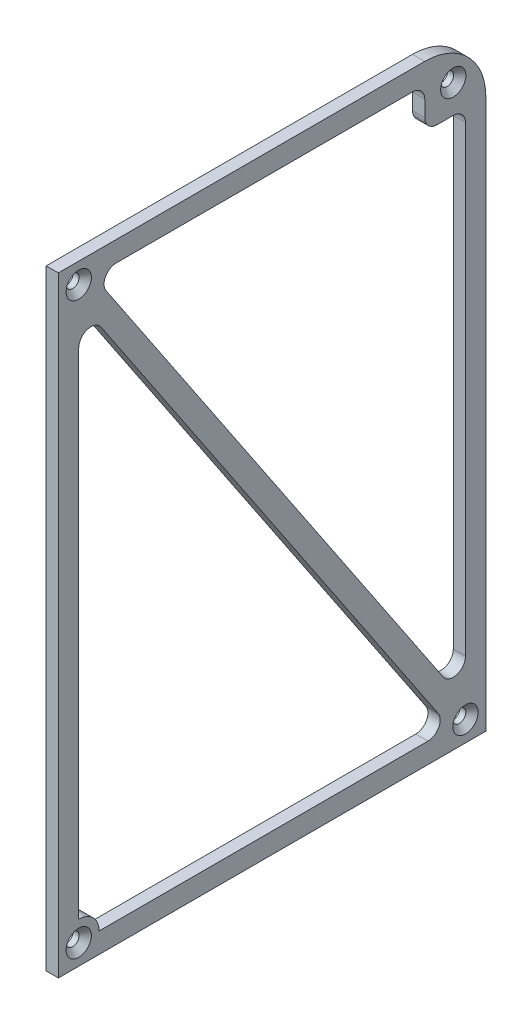
ISO-10303-21;
HEADER;
FILE_DESCRIPTION(('STEP AP214'),'2;1');
FILE_NAME('part.step','',(''),(''),'','','');
FILE_SCHEMA(('AUTOMOTIVE_DESIGN { 1 0 10303 214 1 1 1 1 }'));
ENDSEC;
DATA;
#1=APPLICATION_CONTEXT('core data for automotive mechanical design processes');
#2=APPLICATION_PROTOCOL_DEFINITION('international standard','automotive_design',2000,#1);
#3=PRODUCT_CONTEXT('',#1,'mechanical');
#4=PRODUCT('Part','Part','',(#3));
#5=PRODUCT_RELATED_PRODUCT_CATEGORY('part','',(#4));
#6=PRODUCT_DEFINITION_FORMATION('','',#4);
#7=PRODUCT_DEFINITION_CONTEXT('part definition',#1,'design');
#8=PRODUCT_DEFINITION('design','',#6,#7);
#9=PRODUCT_DEFINITION_SHAPE('','',#8);
#10=(LENGTH_UNIT() NAMED_UNIT(*) SI_UNIT(.MILLI.,.METRE.));
#11=(NAMED_UNIT(*) PLANE_ANGLE_UNIT() SI_UNIT($,.RADIAN.));
#12=(NAMED_UNIT(*) SI_UNIT($,.STERADIAN.) SOLID_ANGLE_UNIT());
#13=UNCERTAINTY_MEASURE_WITH_UNIT(LENGTH_MEASURE(1.E-05),#10,'distance_accuracy_value','');
#14=(GEOMETRIC_REPRESENTATION_CONTEXT(3) GLOBAL_UNCERTAINTY_ASSIGNED_CONTEXT((#13)) GLOBAL_UNIT_ASSIGNED_CONTEXT((#10,
#11,#12)) REPRESENTATION_CONTEXT('',''));
#15=CARTESIAN_POINT('',(0.,0.,0.));
#16=DIRECTION('',(0.,0.,1.));
#17=DIRECTION('',(1.,0.,0.));
#18=AXIS2_PLACEMENT_3D('',#15,#16,#17);
#19=CARTESIAN_POINT('',(3.,5.,0.));
#20=DIRECTION('',(0.,1.,0.));
#21=DIRECTION('',(0.,0.,1.));
#22=AXIS2_PLACEMENT_3D('',#19,#20,#21);
#23=PLANE('',#22);
#24=DIRECTION('',(0.,0.,-1.));
#25=VECTOR('',#24,1.);
#26=CARTESIAN_POINT('',(3.,5.,0.));
#27=LINE('',#26,#25);
#28=CARTESIAN_POINT('',(3.,5.,-10.));
#29=VERTEX_POINT('',#28);
#30=CARTESIAN_POINT('',(3.,5.,-90.7784812930599));
#31=VERTEX_POINT('',#30);
#32=EDGE_CURVE('E228',#29,#31,#27,.T.);
#33=ORIENTED_EDGE('',*,*,#32,.T.);
#34=DIRECTION('',(-1.,0.,0.));
#35=VECTOR('',#34,1.);
#36=CARTESIAN_POINT('',(3.,5.,-90.7784812930599));
#37=LINE('',#36,#35);
#38=CARTESIAN_POINT('',(0.,5.,-90.7784812930599));
#39=VERTEX_POINT('',#38);
#40=EDGE_CURVE('E327',#31,#39,#37,.T.);
#41=ORIENTED_EDGE('',*,*,#40,.T.);
#42=DIRECTION('',(0.,0.,-1.));
#43=VECTOR('',#42,1.);
#44=CARTESIAN_POINT('',(0.,5.,0.));
#45=LINE('',#44,#43);
#46=CARTESIAN_POINT('',(0.,5.,-10.));
#47=VERTEX_POINT('',#46);
#48=EDGE_CURVE('E277',#47,#39,#45,.T.);
#49=ORIENTED_EDGE('',*,*,#48,.F.);
#50=DIRECTION('',(-1.,0.,0.));
#51=VECTOR('',#50,1.);
#52=CARTESIAN_POINT('',(3.,5.,-10.));
#53=LINE('',#52,#51);
#54=EDGE_CURVE('E289',#29,#47,#53,.T.);
#55=ORIENTED_EDGE('',*,*,#54,.F.);
#56=EDGE_LOOP('',(#33,#41,#49,#55));
#57=FACE_BOUND('',#56,.T.);
#58=ADVANCED_FACE('F35',(#57),#23,.T.);
#59=CARTESIAN_POINT('',(3.,5.,-5.));
#60=DIRECTION('',(-1.,0.,0.));
#61=DIRECTION('',(0.,0.,1.));
#62=AXIS2_PLACEMENT_3D('',#59,#60,#61);
#63=CYLINDRICAL_SURFACE('',#62,5.);
#64=CARTESIAN_POINT('',(0.,5.,-5.));
#65=DIRECTION('',(1.,0.,0.));
#66=DIRECTION('',(0.,0.,-1.));
#67=AXIS2_PLACEMENT_3D('',#64,#65,#66);
#68=CIRCLE('',#67,5.);
#69=CARTESIAN_POINT('',(0.,10.,-5.));
#70=VERTEX_POINT('',#69);
#71=EDGE_CURVE('E280',#47,#70,#68,.T.);
#72=ORIENTED_EDGE('',*,*,#71,.T.);
#73=DIRECTION('',(-1.,0.,0.));
#74=VECTOR('',#73,1.);
#75=CARTESIAN_POINT('',(3.,10.,-5.));
#76=LINE('',#75,#74);
#77=CARTESIAN_POINT('',(3.,10.,-5.));
#78=VERTEX_POINT('',#77);
#79=EDGE_CURVE('E190',#78,#70,#76,.T.);
#80=ORIENTED_EDGE('',*,*,#79,.F.);
#81=CARTESIAN_POINT('',(3.,5.,-5.));
#82=DIRECTION('',(1.,0.,0.));
#83=DIRECTION('',(0.,0.,-1.));
#84=AXIS2_PLACEMENT_3D('',#81,#82,#83);
#85=CIRCLE('',#84,5.);
#86=EDGE_CURVE('E231',#29,#78,#85,.T.);
#87=ORIENTED_EDGE('',*,*,#86,.F.);
#88=ORIENTED_EDGE('',*,*,#54,.T.);
#89=EDGE_LOOP('',(#72,#80,#87,#88));
#90=FACE_BOUND('',#89,.T.);
#91=ADVANCED_FACE('F396',(#90),#63,.T.);
#92=CARTESIAN_POINT('',(3.,0.,-5.));
#93=DIRECTION('',(0.,0.,1.));
#94=DIRECTION('',(1.,0.,0.));
#95=AXIS2_PLACEMENT_3D('',#92,#93,#94);
#96=PLANE('',#95);
#97=DIRECTION('',(0.,1.,0.));
#98=VECTOR('',#97,1.);
#99=CARTESIAN_POINT('',(0.,0.,-5.));
#100=LINE('',#99,#98);
#101=CARTESIAN_POINT('',(0.,131.533751076295,-5.));
#102=VERTEX_POINT('',#101);
#103=EDGE_CURVE('E283',#70,#102,#100,.T.);
#104=ORIENTED_EDGE('',*,*,#103,.T.);
#105=DIRECTION('',(-1.,0.,0.));
#106=VECTOR('',#105,1.);
#107=CARTESIAN_POINT('',(3.,131.533751076295,-5.));
#108=LINE('',#107,#106);
#109=CARTESIAN_POINT('',(3.,131.533751076295,-5.));
#110=VERTEX_POINT('',#109);
#111=EDGE_CURVE('E334',#102,#110,#108,.F.);
#112=ORIENTED_EDGE('',*,*,#111,.T.);
#113=DIRECTION('',(0.,1.,0.));
#114=VECTOR('',#113,1.);
#115=CARTESIAN_POINT('',(3.,0.,-5.));
#116=LINE('',#115,#114);
#117=EDGE_CURVE('E234',#78,#110,#116,.T.);
#118=ORIENTED_EDGE('',*,*,#117,.F.);
#119=ORIENTED_EDGE('',*,*,#79,.T.);
#120=EDGE_LOOP('',(#104,#112,#118,#119));
#121=FACE_BOUND('',#120,.T.);
#122=ADVANCED_FACE('F402',(#121),#96,.F.);
#123=CARTESIAN_POINT('',(3.,0.,-90.));
#124=DIRECTION('',(0.,0.,-1.));
#125=DIRECTION('',(-1.,0.,0.));
#126=AXIS2_PLACEMENT_3D('',#123,#124,#125);
#127=PLANE('',#126);
#128=DIRECTION('',(0.,-1.,0.));
#129=VECTOR('',#128,1.);
#130=CARTESIAN_POINT('',(0.,0.,-90.));
#131=LINE('',#130,#129);
#132=CARTESIAN_POINT('',(0.,142.,-90.));
#133=VERTEX_POINT('',#132);
#134=CARTESIAN_POINT('',(0.,138.,-90.));
#135=VERTEX_POINT('',#134);
#136=EDGE_CURVE('E262',#133,#135,#131,.T.);
#137=ORIENTED_EDGE('',*,*,#136,.T.);
#138=DIRECTION('',(-1.,0.,0.));
#139=VECTOR('',#138,1.);
#140=CARTESIAN_POINT('',(3.,138.,-90.));
#141=LINE('',#140,#139);
#142=CARTESIAN_POINT('',(3.,138.,-90.));
#143=VERTEX_POINT('',#142);
#144=EDGE_CURVE('E313',#135,#143,#141,.F.);
#145=ORIENTED_EDGE('',*,*,#144,.T.);
#146=DIRECTION('',(0.,-1.,0.));
#147=VECTOR('',#146,1.);
#148=CARTESIAN_POINT('',(3.,0.,-90.));
#149=LINE('',#148,#147);
#150=CARTESIAN_POINT('',(3.,142.,-90.));
#151=VERTEX_POINT('',#150);
#152=EDGE_CURVE('E213',#151,#143,#149,.T.);
#153=ORIENTED_EDGE('',*,*,#152,.F.);
#154=DIRECTION('',(-1.,0.,0.));
#155=VECTOR('',#154,1.);
#156=CARTESIAN_POINT('',(0.,142.,-90.));
#157=LINE('',#156,#155);
#158=EDGE_CURVE('E310',#151,#133,#157,.T.);
#159=ORIENTED_EDGE('',*,*,#158,.T.);
#160=EDGE_LOOP('',(#137,#145,#153,#159));
#161=FACE_BOUND('',#160,.T.);
#162=ADVANCED_FACE('F424',(#161),#127,.F.);
#163=CARTESIAN_POINT('',(3.,135.,0.));
#164=DIRECTION('',(0.,1.,0.));
#165=DIRECTION('',(0.,0.,1.));
#166=AXIS2_PLACEMENT_3D('',#163,#164,#165);
#167=PLANE('',#166);
#168=DIRECTION('',(0.,0.,-1.));
#169=VECTOR('',#168,1.);
#170=CARTESIAN_POINT('',(0.,135.,0.));
#171=LINE('',#170,#169);
#172=CARTESIAN_POINT('',(0.,135.,-93.));
#173=VERTEX_POINT('',#172);
#174=CARTESIAN_POINT('',(0.,135.,-97.));
#175=VERTEX_POINT('',#174);
#176=EDGE_CURVE('E265',#173,#175,#171,.T.);
#177=ORIENTED_EDGE('',*,*,#176,.T.);
#178=DIRECTION('',(-1.,0.,0.));
#179=VECTOR('',#178,1.);
#180=CARTESIAN_POINT('',(3.,135.,-97.));
#181=LINE('',#180,#179);
#182=CARTESIAN_POINT('',(3.,135.,-97.));
#183=VERTEX_POINT('',#182);
#184=EDGE_CURVE('E306',#175,#183,#181,.F.);
#185=ORIENTED_EDGE('',*,*,#184,.T.);
#186=DIRECTION('',(0.,0.,-1.));
#187=VECTOR('',#186,1.);
#188=CARTESIAN_POINT('',(3.,135.,0.));
#189=LINE('',#188,#187);
#190=CARTESIAN_POINT('',(3.,135.,-93.));
#191=VERTEX_POINT('',#190);
#192=EDGE_CURVE('E216',#191,#183,#189,.T.);
#193=ORIENTED_EDGE('',*,*,#192,.F.);
#194=DIRECTION('',(-1.,0.,0.));
#195=VECTOR('',#194,1.);
#196=CARTESIAN_POINT('',(3.,135.,-93.));
#197=LINE('',#196,#195);
#198=EDGE_CURVE('E303',#191,#173,#197,.T.);
#199=ORIENTED_EDGE('',*,*,#198,.T.);
#200=EDGE_LOOP('',(#177,#185,#193,#199));
#201=FACE_BOUND('',#200,.T.);
#202=ADVANCED_FACE('F420',(#201),#167,.F.);
#203=CARTESIAN_POINT('',(3.,0.,-100.));
#204=DIRECTION('',(0.,0.,1.));
#205=DIRECTION('',(1.,0.,0.));
#206=AXIS2_PLACEMENT_3D('',#203,#204,#205);
#207=PLANE('',#206);
#208=DIRECTION('',(0.,1.,0.));
#209=VECTOR('',#208,1.);
#210=CARTESIAN_POINT('',(3.,0.,-100.));
#211=LINE('',#210,#209);
#212=CARTESIAN_POINT('',(3.,18.466248923705,-100.));
#213=VERTEX_POINT('',#212);
#214=CARTESIAN_POINT('',(3.,132.,-100.));
#215=VERTEX_POINT('',#214);
#216=EDGE_CURVE('E219',#213,#215,#211,.T.);
#217=ORIENTED_EDGE('',*,*,#216,.T.);
#218=DIRECTION('',(-1.,0.,0.));
#219=VECTOR('',#218,1.);
#220=CARTESIAN_POINT('',(3.,132.,-100.));
#221=LINE('',#220,#219);
#222=CARTESIAN_POINT('',(0.,132.,-100.));
#223=VERTEX_POINT('',#222);
#224=EDGE_CURVE('E300',#215,#223,#221,.T.);
#225=ORIENTED_EDGE('',*,*,#224,.T.);
#226=DIRECTION('',(0.,1.,0.));
#227=VECTOR('',#226,1.);
#228=CARTESIAN_POINT('',(0.,0.,-100.));
#229=LINE('',#228,#227);
#230=CARTESIAN_POINT('',(0.,18.466248923705,-100.));
#231=VERTEX_POINT('',#230);
#232=EDGE_CURVE('E268',#231,#223,#229,.T.);
#233=ORIENTED_EDGE('',*,*,#232,.F.);
#234=DIRECTION('',(-1.,0.,0.));
#235=VECTOR('',#234,1.);
#236=CARTESIAN_POINT('',(3.,18.466248923705,-100.));
#237=LINE('',#236,#235);
#238=EDGE_CURVE('E291',#231,#213,#237,.F.);
#239=ORIENTED_EDGE('',*,*,#238,.T.);
#240=EDGE_LOOP('',(#217,#225,#233,#239));
#241=FACE_BOUND('',#240,.T.);
#242=ADVANCED_FACE('F416',(#241),#207,.T.);
#243=CARTESIAN_POINT('',(3.,48.9092313787051,-72.9892687095774));
#244=DIRECTION('',(0.,-0.556666326132182,0.83073618035481));
#245=DIRECTION('',(0.,-0.83073618035481,-0.556666326132182));
#246=AXIS2_PLACEMENT_3D('',#243,#244,#245);
#247=PLANE('',#246);
#248=DIRECTION('',(0.,0.83073618035481,0.556666326132182));
#249=VECTOR('',#248,1.);
#250=CARTESIAN_POINT('',(3.,48.9092313787051,-72.9892687095774));
#251=LINE('',#250,#249);
#252=CARTESIAN_POINT('',(3.,16.7962499453084,-94.5077914589356));
#253=VERTEX_POINT('',#252);
#254=CARTESIAN_POINT('',(3.,140.330001021603,-11.7293101658757));
#255=VERTEX_POINT('',#254);
#256=EDGE_CURVE('E222',#253,#255,#251,.T.);
#257=ORIENTED_EDGE('',*,*,#256,.F.);
#258=DIRECTION('',(-1.,0.,0.));
#259=VECTOR('',#258,1.);
#260=CARTESIAN_POINT('',(3.,16.7962499453084,-94.5077914589356));
#261=LINE('',#260,#259);
#262=CARTESIAN_POINT('',(0.,16.7962499453084,-94.5077914589356));
#263=VERTEX_POINT('',#262);
#264=EDGE_CURVE('E324',#253,#263,#261,.T.);
#265=ORIENTED_EDGE('',*,*,#264,.T.);
#266=DIRECTION('',(0.,0.83073618035481,0.556666326132182));
#267=VECTOR('',#266,1.);
#268=CARTESIAN_POINT('',(0.,48.9092313787051,-72.9892687095774));
#269=LINE('',#268,#267);
#270=CARTESIAN_POINT('',(0.,140.330001021603,-11.7293101658757));
#271=VERTEX_POINT('',#270);
#272=EDGE_CURVE('E271',#263,#271,#269,.T.);
#273=ORIENTED_EDGE('',*,*,#272,.T.);
#274=DIRECTION('',(-1.,0.,0.));
#275=VECTOR('',#274,1.);
#276=CARTESIAN_POINT('',(3.,140.330001021603,-11.7293101658757));
#277=LINE('',#276,#275);
#278=EDGE_CURVE('E322',#271,#255,#277,.F.);
#279=ORIENTED_EDGE('',*,*,#278,.T.);
#280=EDGE_LOOP('',(#257,#265,#273,#279));
#281=FACE_BOUND('',#280,.T.);
#282=ADVANCED_FACE('F413',(#281),#247,.F.);
#283=CARTESIAN_POINT('',(3.,135.,-90.));
#284=DIRECTION('',(-1.,0.,0.));
#285=DIRECTION('',(0.,0.,1.));
#286=AXIS2_PLACEMENT_3D('',#283,#284,#285);
#287=CYLINDRICAL_SURFACE('',#286,15.);
#288=CARTESIAN_POINT('',(0.,135.,-90.));
#289=DIRECTION('',(1.,0.,0.));
#290=DIRECTION('',(0.,0.,-1.));
#291=AXIS2_PLACEMENT_3D('',#288,#289,#290);
#292=CIRCLE('',#291,15.);
#293=CARTESIAN_POINT('',(0.,150.,-90.));
#294=VERTEX_POINT('',#293);
#295=CARTESIAN_POINT('',(0.,135.,-105.));
#296=VERTEX_POINT('',#295);
#297=EDGE_CURVE('E185',#294,#296,#292,.F.);
#298=ORIENTED_EDGE('',*,*,#297,.F.);
#299=DIRECTION('',(-1.,0.,0.));
#300=VECTOR('',#299,1.);
#301=CARTESIAN_POINT('',(3.,150.,-90.));
#302=LINE('',#301,#300);
#303=CARTESIAN_POINT('',(3.,150.,-90.));
#304=VERTEX_POINT('',#303);
#305=EDGE_CURVE('E180',#304,#294,#302,.T.);
#306=ORIENTED_EDGE('',*,*,#305,.F.);
#307=CARTESIAN_POINT('',(3.,135.,-90.));
#308=DIRECTION('',(1.,0.,0.));
#309=DIRECTION('',(0.,0.,-1.));
#310=AXIS2_PLACEMENT_3D('',#307,#308,#309);
#311=CIRCLE('',#310,15.);
#312=CARTESIAN_POINT('',(3.,135.,-105.));
#313=VERTEX_POINT('',#312);
#314=EDGE_CURVE('E183',#304,#313,#311,.F.);
#315=ORIENTED_EDGE('',*,*,#314,.T.);
#316=DIRECTION('',(-1.,0.,0.));
#317=VECTOR('',#316,1.);
#318=CARTESIAN_POINT('',(3.,135.,-105.));
#319=LINE('',#318,#317);
#320=EDGE_CURVE('E238',#313,#296,#319,.T.);
#321=ORIENTED_EDGE('',*,*,#320,.T.);
#322=EDGE_LOOP('',(#298,#306,#315,#321));
#323=FACE_BOUND('',#322,.T.);
#324=ADVANCED_FACE('F182',(#323),#287,.T.);
#325=CARTESIAN_POINT('',(3.,150.,0.));
#326=DIRECTION('',(0.,1.,0.));
#327=DIRECTION('',(0.,0.,1.));
#328=AXIS2_PLACEMENT_3D('',#325,#326,#327);
#329=PLANE('',#328);
#330=DIRECTION('',(0.,0.,-1.));
#331=VECTOR('',#330,1.);
#332=CARTESIAN_POINT('',(0.,150.,0.));
#333=LINE('',#332,#331);
#334=CARTESIAN_POINT('',(0.,150.,0.));
#335=VERTEX_POINT('',#334);
#336=EDGE_CURVE('E240',#335,#294,#333,.T.);
#337=ORIENTED_EDGE('',*,*,#336,.F.);
#338=DIRECTION('',(-1.,0.,0.));
#339=VECTOR('',#338,1.);
#340=CARTESIAN_POINT('',(3.,150.,0.));
#341=LINE('',#340,#339);
#342=CARTESIAN_POINT('',(3.,150.,0.));
#343=VERTEX_POINT('',#342);
#344=EDGE_CURVE('E191',#343,#335,#341,.T.);
#345=ORIENTED_EDGE('',*,*,#344,.F.);
#346=DIRECTION('',(0.,0.,-1.));
#347=VECTOR('',#346,1.);
#348=CARTESIAN_POINT('',(3.,150.,0.));
#349=LINE('',#348,#347);
#350=EDGE_CURVE('E198',#343,#304,#349,.T.);
#351=ORIENTED_EDGE('',*,*,#350,.T.);
#352=ORIENTED_EDGE('',*,*,#305,.T.);
#353=EDGE_LOOP('',(#337,#345,#351,#352));
#354=FACE_BOUND('',#353,.T.);
#355=ADVANCED_FACE('F205',(#354),#329,.T.);
#356=CARTESIAN_POINT('',(3.,0.,0.));
#357=DIRECTION('',(0.,0.,1.));
#358=DIRECTION('',(1.,0.,0.));
#359=AXIS2_PLACEMENT_3D('',#356,#357,#358);
#360=PLANE('',#359);
#361=DIRECTION('',(0.,1.,0.));
#362=VECTOR('',#361,1.);
#363=CARTESIAN_POINT('',(0.,0.,0.));
#364=LINE('',#363,#362);
#365=CARTESIAN_POINT('',(0.,0.,0.));
#366=VERTEX_POINT('',#365);
#367=EDGE_CURVE('E242',#366,#335,#364,.T.);
#368=ORIENTED_EDGE('',*,*,#367,.F.);
#369=DIRECTION('',(-1.,0.,0.));
#370=VECTOR('',#369,1.);
#371=CARTESIAN_POINT('',(3.,0.,0.));
#372=LINE('',#371,#370);
#373=CARTESIAN_POINT('',(3.,0.,0.));
#374=VERTEX_POINT('',#373);
#375=EDGE_CURVE('E296',#374,#366,#372,.T.);
#376=ORIENTED_EDGE('',*,*,#375,.F.);
#377=DIRECTION('',(0.,1.,0.));
#378=VECTOR('',#377,1.);
#379=CARTESIAN_POINT('',(3.,0.,0.));
#380=LINE('',#379,#378);
#381=EDGE_CURVE('E206',#374,#343,#380,.T.);
#382=ORIENTED_EDGE('',*,*,#381,.T.);
#383=ORIENTED_EDGE('',*,*,#344,.T.);
#384=EDGE_LOOP('',(#368,#376,#382,#383));
#385=FACE_BOUND('',#384,.T.);
#386=ADVANCED_FACE('F449',(#385),#360,.T.);
#387=CARTESIAN_POINT('',(3.,0.,0.));
#388=DIRECTION('',(0.,1.,0.));
#389=DIRECTION('',(0.,0.,1.));
#390=AXIS2_PLACEMENT_3D('',#387,#388,#389);
#391=PLANE('',#390);
#392=DIRECTION('',(0.,0.,-1.));
#393=VECTOR('',#392,1.);
#394=CARTESIAN_POINT('',(0.,0.,0.));
#395=LINE('',#394,#393);
#396=CARTESIAN_POINT('',(0.,0.,-105.));
#397=VERTEX_POINT('',#396);
#398=EDGE_CURVE('E245',#366,#397,#395,.T.);
#399=ORIENTED_EDGE('',*,*,#398,.T.);
#400=DIRECTION('',(-1.,0.,0.));
#401=VECTOR('',#400,1.);
#402=CARTESIAN_POINT('',(3.,0.,-105.));
#403=LINE('',#402,#401);
#404=CARTESIAN_POINT('',(3.,0.,-105.));
#405=VERTEX_POINT('',#404);
#406=EDGE_CURVE('E293',#405,#397,#403,.T.);
#407=ORIENTED_EDGE('',*,*,#406,.F.);
#408=DIRECTION('',(0.,0.,-1.));
#409=VECTOR('',#408,1.);
#410=CARTESIAN_POINT('',(3.,0.,0.));
#411=LINE('',#410,#409);
#412=EDGE_CURVE('E208',#374,#405,#411,.T.);
#413=ORIENTED_EDGE('',*,*,#412,.F.);
#414=ORIENTED_EDGE('',*,*,#375,.T.);
#415=EDGE_LOOP('',(#399,#407,#413,#414));
#416=FACE_BOUND('',#415,.T.);
#417=ADVANCED_FACE('F411',(#416),#391,.F.);
#418=CARTESIAN_POINT('',(3.,145.,0.));
#419=DIRECTION('',(0.,1.,0.));
#420=DIRECTION('',(0.,0.,1.));
#421=AXIS2_PLACEMENT_3D('',#418,#419,#420);
#422=PLANE('',#421);
#423=DIRECTION('',(0.,0.,-1.));
#424=VECTOR('',#423,1.);
#425=CARTESIAN_POINT('',(0.,145.,0.));
#426=LINE('',#425,#424);
#427=CARTESIAN_POINT('',(0.,145.,-14.2215187069401));
#428=VERTEX_POINT('',#427);
#429=CARTESIAN_POINT('',(0.,145.,-87.));
#430=VERTEX_POINT('',#429);
#431=EDGE_CURVE('E274',#428,#430,#426,.T.);
#432=ORIENTED_EDGE('',*,*,#431,.T.);
#433=DIRECTION('',(-1.,0.,0.));
#434=VECTOR('',#433,1.);
#435=CARTESIAN_POINT('',(3.,145.,-87.));
#436=LINE('',#435,#434);
#437=CARTESIAN_POINT('',(3.,145.,-87.));
#438=VERTEX_POINT('',#437);
#439=EDGE_CURVE('E320',#430,#438,#436,.F.);
#440=ORIENTED_EDGE('',*,*,#439,.T.);
#441=DIRECTION('',(0.,0.,-1.));
#442=VECTOR('',#441,1.);
#443=CARTESIAN_POINT('',(3.,145.,0.));
#444=LINE('',#443,#442);
#445=CARTESIAN_POINT('',(3.,145.,-14.2215187069401));
#446=VERTEX_POINT('',#445);
#447=EDGE_CURVE('E225',#446,#438,#444,.T.);
#448=ORIENTED_EDGE('',*,*,#447,.F.);
#449=DIRECTION('',(-1.,0.,0.));
#450=VECTOR('',#449,1.);
#451=CARTESIAN_POINT('',(0.,145.,-14.2215187069401));
#452=LINE('',#451,#450);
#453=EDGE_CURVE('E317',#446,#428,#452,.T.);
#454=ORIENTED_EDGE('',*,*,#453,.T.);
#455=EDGE_LOOP('',(#432,#440,#448,#454));
#456=FACE_BOUND('',#455,.T.);
#457=ADVANCED_FACE('F407',(#456),#422,.F.);
#458=CARTESIAN_POINT('',(3.,145.,-5.));
#459=DIRECTION('',(-1.,0.,0.));
#460=DIRECTION('',(0.,0.,1.));
#461=AXIS2_PLACEMENT_3D('',#458,#459,#460);
#462=CYLINDRICAL_SURFACE('',#461,1.6);
#463=CARTESIAN_POINT('',(1.5,145.,-5.));
#464=DIRECTION('',(1.,0.,0.));
#465=DIRECTION('',(0.,0.,-1.));
#466=AXIS2_PLACEMENT_3D('',#463,#464,#465);
#467=CIRCLE('',#466,1.6);
#468=CARTESIAN_POINT('',(1.5,145.,-6.6));
#469=VERTEX_POINT('',#468);
#470=EDGE_CURVE('E11',#469,#469,#467,.T.);
#471=ORIENTED_EDGE('',*,*,#470,.T.);
#472=EDGE_LOOP('',(#471));
#473=FACE_BOUND('',#472,.T.);
#474=CARTESIAN_POINT('',(0.,145.,-5.));
#475=DIRECTION('',(1.,0.,0.));
#476=DIRECTION('',(0.,0.,-1.));
#477=AXIS2_PLACEMENT_3D('',#474,#475,#476);
#478=CIRCLE('',#477,1.6);
#479=CARTESIAN_POINT('',(0.,145.,-6.6));
#480=VERTEX_POINT('',#479);
#481=EDGE_CURVE('E259',#480,#480,#478,.T.);
#482=ORIENTED_EDGE('',*,*,#481,.F.);
#483=EDGE_LOOP('',(#482));
#484=FACE_BOUND('',#483,.T.);
#485=ADVANCED_FACE('F410',(#473,#484),#462,.F.);
#486=CARTESIAN_POINT('',(3.,142.,-96.9999999999999));
#487=DIRECTION('',(-1.,0.,0.));
#488=DIRECTION('',(0.,0.,1.));
#489=AXIS2_PLACEMENT_3D('',#486,#487,#488);
#490=CYLINDRICAL_SURFACE('',#489,1.6);
#491=CARTESIAN_POINT('',(1.49999999999998,142.,-96.9999999999999));
#492=DIRECTION('',(1.,0.,0.));
#493=DIRECTION('',(0.,0.,-1.));
#494=AXIS2_PLACEMENT_3D('',#491,#492,#493);
#495=CIRCLE('',#494,1.6);
#496=CARTESIAN_POINT('',(1.49999999999998,142.,-98.6));
#497=VERTEX_POINT('',#496);
#498=EDGE_CURVE('E43',#497,#497,#495,.T.);
#499=ORIENTED_EDGE('',*,*,#498,.T.);
#500=EDGE_LOOP('',(#499));
#501=FACE_BOUND('',#500,.T.);
#502=CARTESIAN_POINT('',(0.,142.,-96.9999999999999));
#503=DIRECTION('',(1.,0.,0.));
#504=DIRECTION('',(0.,0.,-1.));
#505=AXIS2_PLACEMENT_3D('',#502,#503,#504);
#506=CIRCLE('',#505,1.6);
#507=CARTESIAN_POINT('',(0.,142.,-98.6));
#508=VERTEX_POINT('',#507);
#509=EDGE_CURVE('E256',#508,#508,#506,.T.);
#510=ORIENTED_EDGE('',*,*,#509,.F.);
#511=EDGE_LOOP('',(#510));
#512=FACE_BOUND('',#511,.T.);
#513=ADVANCED_FACE('F379',(#501,#512),#490,.F.);
#514=CARTESIAN_POINT('',(3.,5.,-100.));
#515=DIRECTION('',(-1.,0.,0.));
#516=DIRECTION('',(0.,0.,1.));
#517=AXIS2_PLACEMENT_3D('',#514,#515,#516);
#518=CYLINDRICAL_SURFACE('',#517,1.60000000000001);
#519=CARTESIAN_POINT('',(1.49999999999998,5.,-100.));
#520=DIRECTION('',(1.,0.,0.));
#521=DIRECTION('',(0.,0.,-1.));
#522=AXIS2_PLACEMENT_3D('',#519,#520,#521);
#523=CIRCLE('',#522,1.60000000000001);
#524=CARTESIAN_POINT('',(1.49999999999998,5.,-101.6));
#525=VERTEX_POINT('',#524);
#526=EDGE_CURVE('E359',#525,#525,#523,.T.);
#527=ORIENTED_EDGE('',*,*,#526,.T.);
#528=EDGE_LOOP('',(#527));
#529=FACE_BOUND('',#528,.T.);
#530=CARTESIAN_POINT('',(0.,5.,-100.));
#531=DIRECTION('',(1.,0.,0.));
#532=DIRECTION('',(0.,0.,-1.));
#533=AXIS2_PLACEMENT_3D('',#530,#531,#532);
#534=CIRCLE('',#533,1.60000000000001);
#535=CARTESIAN_POINT('',(0.,5.,-101.6));
#536=VERTEX_POINT('',#535);
#537=EDGE_CURVE('E253',#536,#536,#534,.T.);
#538=ORIENTED_EDGE('',*,*,#537,.F.);
#539=EDGE_LOOP('',(#538));
#540=FACE_BOUND('',#539,.T.);
#541=ADVANCED_FACE('F434',(#529,#540),#518,.F.);
#542=CARTESIAN_POINT('',(3.,5.,-5.));
#543=DIRECTION('',(-1.,0.,0.));
#544=DIRECTION('',(0.,0.,1.));
#545=AXIS2_PLACEMENT_3D('',#542,#543,#544);
#546=CYLINDRICAL_SURFACE('',#545,1.6);
#547=CARTESIAN_POINT('',(1.49999999999997,5.,-5.));
#548=DIRECTION('',(1.,0.,0.));
#549=DIRECTION('',(0.,0.,-1.));
#550=AXIS2_PLACEMENT_3D('',#547,#548,#549);
#551=CIRCLE('',#550,1.6);
#552=CARTESIAN_POINT('',(1.49999999999997,5.,-6.6));
#553=VERTEX_POINT('',#552);
#554=EDGE_CURVE('E374',#553,#553,#551,.T.);
#555=ORIENTED_EDGE('',*,*,#554,.T.);
#556=EDGE_LOOP('',(#555));
#557=FACE_BOUND('',#556,.T.);
#558=CARTESIAN_POINT('',(0.,5.,-5.));
#559=DIRECTION('',(1.,0.,0.));
#560=DIRECTION('',(0.,0.,-1.));
#561=AXIS2_PLACEMENT_3D('',#558,#559,#560);
#562=CIRCLE('',#561,1.6);
#563=CARTESIAN_POINT('',(0.,5.,-6.6));
#564=VERTEX_POINT('',#563);
#565=EDGE_CURVE('E250',#564,#564,#562,.T.);
#566=ORIENTED_EDGE('',*,*,#565,.F.);
#567=EDGE_LOOP('',(#566));
#568=FACE_BOUND('',#567,.T.);
#569=ADVANCED_FACE('F437',(#557,#568),#546,.F.);
#570=CARTESIAN_POINT('',(3.,0.,-105.));
#571=DIRECTION('',(0.,0.,1.));
#572=DIRECTION('',(1.,0.,0.));
#573=AXIS2_PLACEMENT_3D('',#570,#571,#572);
#574=PLANE('',#573);
#575=DIRECTION('',(0.,1.,0.));
#576=VECTOR('',#575,1.);
#577=CARTESIAN_POINT('',(0.,0.,-105.));
#578=LINE('',#577,#576);
#579=EDGE_CURVE('E247',#397,#296,#578,.T.);
#580=ORIENTED_EDGE('',*,*,#579,.T.);
#581=ORIENTED_EDGE('',*,*,#320,.F.);
#582=DIRECTION('',(0.,1.,0.));
#583=VECTOR('',#582,1.);
#584=CARTESIAN_POINT('',(3.,0.,-105.));
#585=LINE('',#584,#583);
#586=EDGE_CURVE('E201',#405,#313,#585,.T.);
#587=ORIENTED_EDGE('',*,*,#586,.F.);
#588=ORIENTED_EDGE('',*,*,#406,.T.);
#589=EDGE_LOOP('',(#580,#581,#587,#588));
#590=FACE_BOUND('',#589,.T.);
#591=ADVANCED_FACE('F441',(#590),#574,.F.);
#592=CARTESIAN_POINT('',(3.,46.1288784565554,-68.8400330577041));
#593=DIRECTION('',(0.,0.556666326132182,-0.83073618035481));
#594=DIRECTION('',(0.,0.83073618035481,0.556666326132182));
#595=AXIS2_PLACEMENT_3D('',#592,#593,#594);
#596=PLANE('',#595);
#597=DIRECTION('',(0.,-0.83073618035481,-0.556666326132182));
#598=VECTOR('',#597,1.);
#599=CARTESIAN_POINT('',(0.,46.1288784565554,-68.8400330577041));
#600=LINE('',#599,#598);
#601=CARTESIAN_POINT('',(0.,133.203750054692,-10.4922085410644));
#602=VERTEX_POINT('',#601);
#603=CARTESIAN_POINT('',(0.,9.66999897839654,-93.2706898341243));
#604=VERTEX_POINT('',#603);
#605=EDGE_CURVE('E203',#602,#604,#600,.T.);
#606=ORIENTED_EDGE('',*,*,#605,.T.);
#607=DIRECTION('',(-1.,0.,0.));
#608=VECTOR('',#607,1.);
#609=CARTESIAN_POINT('',(3.,9.66999897839654,-93.2706898341243));
#610=LINE('',#609,#608);
#611=CARTESIAN_POINT('',(3.,9.66999897839654,-93.2706898341243));
#612=VERTEX_POINT('',#611);
#613=EDGE_CURVE('E50',#604,#612,#610,.F.);
#614=ORIENTED_EDGE('',*,*,#613,.T.);
#615=DIRECTION('',(0.,-0.83073618035481,-0.556666326132182));
#616=VECTOR('',#615,1.);
#617=CARTESIAN_POINT('',(3.,46.1288784565554,-68.8400330577041));
#618=LINE('',#617,#616);
#619=CARTESIAN_POINT('',(3.,133.203750054692,-10.4922085410644));
#620=VERTEX_POINT('',#619);
#621=EDGE_CURVE('E236',#620,#612,#618,.T.);
#622=ORIENTED_EDGE('',*,*,#621,.F.);
#623=DIRECTION('',(-1.,0.,0.));
#624=VECTOR('',#623,1.);
#625=CARTESIAN_POINT('',(0.,133.203750054692,-10.4922085410644));
#626=LINE('',#625,#624);
#627=EDGE_CURVE('E330',#620,#602,#626,.T.);
#628=ORIENTED_EDGE('',*,*,#627,.T.);
#629=EDGE_LOOP('',(#606,#614,#622,#628));
#630=FACE_BOUND('',#629,.T.);
#631=ADVANCED_FACE('F445',(#630),#596,.F.);
#632=CARTESIAN_POINT('',(3.,0.,0.));
#633=DIRECTION('',(1.,0.,0.));
#634=DIRECTION('',(0.,0.,-1.));
#635=AXIS2_PLACEMENT_3D('',#632,#633,#634);
#636=PLANE('',#635);
#637=CARTESIAN_POINT('',(3.,5.,-100.));
#638=DIRECTION('',(1.,0.,0.));
#639=DIRECTION('',(0.,0.,-1.));
#640=AXIS2_PLACEMENT_3D('',#637,#638,#639);
#641=CIRCLE('',#640,3.10000000000005);
#642=CARTESIAN_POINT('',(3.,5.,-103.1));
#643=VERTEX_POINT('',#642);
#644=EDGE_CURVE('E371',#643,#643,#641,.F.);
#645=ORIENTED_EDGE('',*,*,#644,.T.);
#646=EDGE_LOOP('',(#645));
#647=FACE_BOUND('',#646,.T.);
#648=CARTESIAN_POINT('',(3.,5.,-5.));
#649=DIRECTION('',(1.,0.,0.));
#650=DIRECTION('',(0.,0.,-1.));
#651=AXIS2_PLACEMENT_3D('',#648,#649,#650);
#652=CIRCLE('',#651,3.10000000000002);
#653=CARTESIAN_POINT('',(3.,5.,-8.10000000000002));
#654=VERTEX_POINT('',#653);
#655=EDGE_CURVE('E368',#654,#654,#652,.F.);
#656=ORIENTED_EDGE('',*,*,#655,.T.);
#657=EDGE_LOOP('',(#656));
#658=FACE_BOUND('',#657,.T.);
#659=CARTESIAN_POINT('',(3.,142.,-96.9999999999999));
#660=DIRECTION('',(1.,0.,0.));
#661=DIRECTION('',(0.,0.,-1.));
#662=AXIS2_PLACEMENT_3D('',#659,#660,#661);
#663=CIRCLE('',#662,3.10000000000005);
#664=CARTESIAN_POINT('',(3.,142.,-100.1));
#665=VERTEX_POINT('',#664);
#666=EDGE_CURVE('E365',#665,#665,#663,.F.);
#667=ORIENTED_EDGE('',*,*,#666,.T.);
#668=EDGE_LOOP('',(#667));
#669=FACE_BOUND('',#668,.T.);
#670=CARTESIAN_POINT('',(3.,145.,-5.));
#671=DIRECTION('',(1.,0.,0.));
#672=DIRECTION('',(0.,0.,-1.));
#673=AXIS2_PLACEMENT_3D('',#670,#671,#672);
#674=CIRCLE('',#673,3.09999999999999);
#675=CARTESIAN_POINT('',(3.,145.,-8.09999999999999));
#676=VERTEX_POINT('',#675);
#677=EDGE_CURVE('E362',#676,#676,#674,.F.);
#678=ORIENTED_EDGE('',*,*,#677,.T.);
#679=EDGE_LOOP('',(#678));
#680=FACE_BOUND('',#679,.T.);
#681=ORIENTED_EDGE('',*,*,#314,.F.);
#682=ORIENTED_EDGE('',*,*,#350,.F.);
#683=ORIENTED_EDGE('',*,*,#381,.F.);
#684=ORIENTED_EDGE('',*,*,#412,.T.);
#685=ORIENTED_EDGE('',*,*,#586,.T.);
#686=EDGE_LOOP('',(#681,#682,#683,#684,#685));
#687=FACE_BOUND('',#686,.T.);
#688=ORIENTED_EDGE('',*,*,#152,.T.);
#689=CARTESIAN_POINT('',(3.,138.,-93.));
#690=DIRECTION('',(1.,0.,0.));
#691=DIRECTION('',(0.,0.,-1.));
#692=AXIS2_PLACEMENT_3D('',#689,#690,#691);
#693=CIRCLE('',#692,3.);
#694=EDGE_CURVE('E315',#143,#191,#693,.T.);
#695=ORIENTED_EDGE('',*,*,#694,.T.);
#696=ORIENTED_EDGE('',*,*,#192,.T.);
#697=CARTESIAN_POINT('',(3.,132.,-97.));
#698=DIRECTION('',(1.,0.,0.));
#699=DIRECTION('',(0.,0.,-1.));
#700=AXIS2_PLACEMENT_3D('',#697,#698,#699);
#701=CIRCLE('',#700,3.);
#702=EDGE_CURVE('E338',#183,#215,#701,.F.);
#703=ORIENTED_EDGE('',*,*,#702,.T.);
#704=ORIENTED_EDGE('',*,*,#216,.F.);
#705=CARTESIAN_POINT('',(3.,18.466248923705,-97.));
#706=DIRECTION('',(1.,0.,0.));
#707=DIRECTION('',(0.,0.,-1.));
#708=AXIS2_PLACEMENT_3D('',#705,#706,#707);
#709=CIRCLE('',#708,3.);
#710=EDGE_CURVE('E346',#213,#253,#709,.F.);
#711=ORIENTED_EDGE('',*,*,#710,.T.);
#712=ORIENTED_EDGE('',*,*,#256,.T.);
#713=CARTESIAN_POINT('',(3.,142.,-14.2215187069401));
#714=DIRECTION('',(1.,0.,0.));
#715=DIRECTION('',(0.,0.,-1.));
#716=AXIS2_PLACEMENT_3D('',#713,#714,#715);
#717=CIRCLE('',#716,3.);
#718=EDGE_CURVE('E357',#255,#446,#717,.F.);
#719=ORIENTED_EDGE('',*,*,#718,.T.);
#720=ORIENTED_EDGE('',*,*,#447,.T.);
#721=CARTESIAN_POINT('',(3.,142.,-87.));
#722=DIRECTION('',(1.,0.,0.));
#723=DIRECTION('',(0.,0.,-1.));
#724=AXIS2_PLACEMENT_3D('',#721,#722,#723);
#725=CIRCLE('',#724,3.);
#726=EDGE_CURVE('E342',#438,#151,#725,.F.);
#727=ORIENTED_EDGE('',*,*,#726,.T.);
#728=EDGE_LOOP('',(#688,#695,#696,#703,#704,#711,#712,#719,#720,#727));
#729=FACE_BOUND('',#728,.T.);
#730=ORIENTED_EDGE('',*,*,#32,.F.);
#731=ORIENTED_EDGE('',*,*,#86,.T.);
#732=ORIENTED_EDGE('',*,*,#117,.T.);
#733=CARTESIAN_POINT('',(3.,131.533751076295,-8.));
#734=DIRECTION('',(1.,0.,0.));
#735=DIRECTION('',(0.,0.,-1.));
#736=AXIS2_PLACEMENT_3D('',#733,#734,#735);
#737=CIRCLE('',#736,3.);
#738=EDGE_CURVE('E57',#110,#620,#737,.F.);
#739=ORIENTED_EDGE('',*,*,#738,.T.);
#740=ORIENTED_EDGE('',*,*,#621,.T.);
#741=CARTESIAN_POINT('',(3.,8.,-90.7784812930599));
#742=DIRECTION('',(1.,0.,0.));
#743=DIRECTION('',(0.,0.,-1.));
#744=AXIS2_PLACEMENT_3D('',#741,#742,#743);
#745=CIRCLE('',#744,3.);
#746=EDGE_CURVE('E350',#612,#31,#745,.F.);
#747=ORIENTED_EDGE('',*,*,#746,.T.);
#748=EDGE_LOOP('',(#730,#731,#732,#739,#740,#747));
#749=FACE_BOUND('',#748,.T.);
#750=ADVANCED_FACE('F195',(#647,#658,#669,#680,#687,#729,#749),#636,.T.);
#751=CARTESIAN_POINT('',(0.,0.,0.));
#752=DIRECTION('',(1.,0.,0.));
#753=DIRECTION('',(0.,0.,-1.));
#754=AXIS2_PLACEMENT_3D('',#751,#752,#753);
#755=PLANE('',#754);
#756=ORIENTED_EDGE('',*,*,#297,.T.);
#757=ORIENTED_EDGE('',*,*,#579,.F.);
#758=ORIENTED_EDGE('',*,*,#398,.F.);
#759=ORIENTED_EDGE('',*,*,#367,.T.);
#760=ORIENTED_EDGE('',*,*,#336,.T.);
#761=EDGE_LOOP('',(#756,#757,#758,#759,#760));
#762=FACE_BOUND('',#761,.T.);
#763=ORIENTED_EDGE('',*,*,#565,.T.);
#764=EDGE_LOOP('',(#763));
#765=FACE_BOUND('',#764,.T.);
#766=ORIENTED_EDGE('',*,*,#537,.T.);
#767=EDGE_LOOP('',(#766));
#768=FACE_BOUND('',#767,.T.);
#769=ORIENTED_EDGE('',*,*,#509,.T.);
#770=EDGE_LOOP('',(#769));
#771=FACE_BOUND('',#770,.T.);
#772=ORIENTED_EDGE('',*,*,#481,.T.);
#773=EDGE_LOOP('',(#772));
#774=FACE_BOUND('',#773,.T.);
#775=ORIENTED_EDGE('',*,*,#176,.F.);
#776=CARTESIAN_POINT('',(0.,138.,-93.));
#777=DIRECTION('',(1.,0.,0.));
#778=DIRECTION('',(0.,0.,-1.));
#779=AXIS2_PLACEMENT_3D('',#776,#777,#778);
#780=CIRCLE('',#779,3.);
#781=EDGE_CURVE('E308',#173,#135,#780,.F.);
#782=ORIENTED_EDGE('',*,*,#781,.T.);
#783=ORIENTED_EDGE('',*,*,#136,.F.);
#784=CARTESIAN_POINT('',(0.,142.,-87.));
#785=DIRECTION('',(1.,0.,0.));
#786=DIRECTION('',(0.,0.,-1.));
#787=AXIS2_PLACEMENT_3D('',#784,#785,#786);
#788=CIRCLE('',#787,3.);
#789=EDGE_CURVE('E340',#133,#430,#788,.T.);
#790=ORIENTED_EDGE('',*,*,#789,.T.);
#791=ORIENTED_EDGE('',*,*,#431,.F.);
#792=CARTESIAN_POINT('',(0.,142.,-14.2215187069401));
#793=DIRECTION('',(1.,0.,0.));
#794=DIRECTION('',(0.,0.,-1.));
#795=AXIS2_PLACEMENT_3D('',#792,#793,#794);
#796=CIRCLE('',#795,3.);
#797=EDGE_CURVE('E355',#428,#271,#796,.T.);
#798=ORIENTED_EDGE('',*,*,#797,.T.);
#799=ORIENTED_EDGE('',*,*,#272,.F.);
#800=CARTESIAN_POINT('',(0.,18.466248923705,-97.));
#801=DIRECTION('',(1.,0.,0.));
#802=DIRECTION('',(0.,0.,-1.));
#803=AXIS2_PLACEMENT_3D('',#800,#801,#802);
#804=CIRCLE('',#803,3.);
#805=EDGE_CURVE('E344',#263,#231,#804,.T.);
#806=ORIENTED_EDGE('',*,*,#805,.T.);
#807=ORIENTED_EDGE('',*,*,#232,.T.);
#808=CARTESIAN_POINT('',(0.,132.,-97.));
#809=DIRECTION('',(1.,0.,0.));
#810=DIRECTION('',(0.,0.,-1.));
#811=AXIS2_PLACEMENT_3D('',#808,#809,#810);
#812=CIRCLE('',#811,3.);
#813=EDGE_CURVE('E336',#223,#175,#812,.T.);
#814=ORIENTED_EDGE('',*,*,#813,.T.);
#815=EDGE_LOOP('',(#775,#782,#783,#790,#791,#798,#799,#806,#807,#814));
#816=FACE_BOUND('',#815,.T.);
#817=ORIENTED_EDGE('',*,*,#48,.T.);
#818=CARTESIAN_POINT('',(0.,8.,-90.7784812930599));
#819=DIRECTION('',(1.,0.,0.));
#820=DIRECTION('',(0.,0.,-1.));
#821=AXIS2_PLACEMENT_3D('',#818,#819,#820);
#822=CIRCLE('',#821,3.);
#823=EDGE_CURVE('E348',#39,#604,#822,.T.);
#824=ORIENTED_EDGE('',*,*,#823,.T.);
#825=ORIENTED_EDGE('',*,*,#605,.F.);
#826=CARTESIAN_POINT('',(0.,131.533751076295,-8.));
#827=DIRECTION('',(1.,0.,0.));
#828=DIRECTION('',(0.,0.,-1.));
#829=AXIS2_PLACEMENT_3D('',#826,#827,#828);
#830=CIRCLE('',#829,3.);
#831=EDGE_CURVE('E352',#602,#102,#830,.T.);
#832=ORIENTED_EDGE('',*,*,#831,.T.);
#833=ORIENTED_EDGE('',*,*,#103,.F.);
#834=ORIENTED_EDGE('',*,*,#71,.F.);
#835=EDGE_LOOP('',(#817,#824,#825,#832,#833,#834));
#836=FACE_BOUND('',#835,.T.);
#837=ADVANCED_FACE('F462',(#762,#765,#768,#771,#774,#816,#836),#755,.F.);
#838=CARTESIAN_POINT('',(3.,132.,-97.));
#839=DIRECTION('',(-1.,0.,0.));
#840=DIRECTION('',(0.,0.,1.));
#841=AXIS2_PLACEMENT_3D('',#838,#839,#840);
#842=CYLINDRICAL_SURFACE('',#841,3.);
#843=ORIENTED_EDGE('',*,*,#702,.F.);
#844=ORIENTED_EDGE('',*,*,#184,.F.);
#845=ORIENTED_EDGE('',*,*,#813,.F.);
#846=ORIENTED_EDGE('',*,*,#224,.F.);
#847=EDGE_LOOP('',(#843,#844,#845,#846));
#848=FACE_BOUND('',#847,.T.);
#849=ADVANCED_FACE('F458',(#848),#842,.F.);
#850=CARTESIAN_POINT('',(3.,138.,-93.));
#851=DIRECTION('',(-1.,0.,0.));
#852=DIRECTION('',(0.,0.,1.));
#853=AXIS2_PLACEMENT_3D('',#850,#851,#852);
#854=CYLINDRICAL_SURFACE('',#853,3.);
#855=ORIENTED_EDGE('',*,*,#694,.F.);
#856=ORIENTED_EDGE('',*,*,#144,.F.);
#857=ORIENTED_EDGE('',*,*,#781,.F.);
#858=ORIENTED_EDGE('',*,*,#198,.F.);
#859=EDGE_LOOP('',(#855,#856,#857,#858));
#860=FACE_BOUND('',#859,.T.);
#861=ADVANCED_FACE('F461',(#860),#854,.T.);
#862=CARTESIAN_POINT('',(3.,142.,-87.));
#863=DIRECTION('',(1.,0.,0.));
#864=DIRECTION('',(0.,0.,-1.));
#865=AXIS2_PLACEMENT_3D('',#862,#863,#864);
#866=CYLINDRICAL_SURFACE('',#865,3.);
#867=ORIENTED_EDGE('',*,*,#726,.F.);
#868=ORIENTED_EDGE('',*,*,#439,.F.);
#869=ORIENTED_EDGE('',*,*,#789,.F.);
#870=ORIENTED_EDGE('',*,*,#158,.F.);
#871=EDGE_LOOP('',(#867,#868,#869,#870));
#872=FACE_BOUND('',#871,.T.);
#873=ADVANCED_FACE('F466',(#872),#866,.F.);
#874=CARTESIAN_POINT('',(3.,18.466248923705,-97.));
#875=DIRECTION('',(-1.,0.,0.));
#876=DIRECTION('',(0.,0.,1.));
#877=AXIS2_PLACEMENT_3D('',#874,#875,#876);
#878=CYLINDRICAL_SURFACE('',#877,3.);
#879=ORIENTED_EDGE('',*,*,#710,.F.);
#880=ORIENTED_EDGE('',*,*,#238,.F.);
#881=ORIENTED_EDGE('',*,*,#805,.F.);
#882=ORIENTED_EDGE('',*,*,#264,.F.);
#883=EDGE_LOOP('',(#879,#880,#881,#882));
#884=FACE_BOUND('',#883,.T.);
#885=ADVANCED_FACE('F470',(#884),#878,.F.);
#886=CARTESIAN_POINT('',(3.,8.,-90.7784812930599));
#887=DIRECTION('',(-1.,0.,0.));
#888=DIRECTION('',(0.,0.,1.));
#889=AXIS2_PLACEMENT_3D('',#886,#887,#888);
#890=CYLINDRICAL_SURFACE('',#889,3.);
#891=ORIENTED_EDGE('',*,*,#746,.F.);
#892=ORIENTED_EDGE('',*,*,#613,.F.);
#893=ORIENTED_EDGE('',*,*,#823,.F.);
#894=ORIENTED_EDGE('',*,*,#40,.F.);
#895=EDGE_LOOP('',(#891,#892,#893,#894));
#896=FACE_BOUND('',#895,.T.);
#897=ADVANCED_FACE('F474',(#896),#890,.F.);
#898=CARTESIAN_POINT('',(3.,131.533751076295,-8.));
#899=DIRECTION('',(1.,0.,0.));
#900=DIRECTION('',(0.,0.,-1.));
#901=AXIS2_PLACEMENT_3D('',#898,#899,#900);
#902=CYLINDRICAL_SURFACE('',#901,3.);
#903=ORIENTED_EDGE('',*,*,#738,.F.);
#904=ORIENTED_EDGE('',*,*,#111,.F.);
#905=ORIENTED_EDGE('',*,*,#831,.F.);
#906=ORIENTED_EDGE('',*,*,#627,.F.);
#907=EDGE_LOOP('',(#903,#904,#905,#906));
#908=FACE_BOUND('',#907,.T.);
#909=ADVANCED_FACE('F478',(#908),#902,.F.);
#910=CARTESIAN_POINT('',(3.,142.,-14.2215187069401));
#911=DIRECTION('',(1.,0.,0.));
#912=DIRECTION('',(0.,0.,-1.));
#913=AXIS2_PLACEMENT_3D('',#910,#911,#912);
#914=CYLINDRICAL_SURFACE('',#913,3.);
#915=ORIENTED_EDGE('',*,*,#718,.F.);
#916=ORIENTED_EDGE('',*,*,#278,.F.);
#917=ORIENTED_EDGE('',*,*,#797,.F.);
#918=ORIENTED_EDGE('',*,*,#453,.F.);
#919=EDGE_LOOP('',(#915,#916,#917,#918));
#920=FACE_BOUND('',#919,.T.);
#921=ADVANCED_FACE('F482',(#920),#914,.F.);
#922=CARTESIAN_POINT('',(1.49999999999998,5.,-100.));
#923=DIRECTION('',(1.,0.,0.));
#924=DIRECTION('',(0.,0.,-1.));
#925=AXIS2_PLACEMENT_3D('',#922,#923,#924);
#926=CONICAL_SURFACE('',#925,1.60000000000001,0.785398163397456);
#927=ORIENTED_EDGE('',*,*,#644,.F.);
#928=EDGE_LOOP('',(#927));
#929=FACE_BOUND('',#928,.T.);
#930=ORIENTED_EDGE('',*,*,#526,.F.);
#931=EDGE_LOOP('',(#930));
#932=FACE_BOUND('',#931,.T.);
#933=ADVANCED_FACE('F391',(#929,#932),#926,.F.);
#934=CARTESIAN_POINT('',(1.49999999999997,5.,-5.));
#935=DIRECTION('',(1.,0.,0.));
#936=DIRECTION('',(0.,0.,-1.));
#937=AXIS2_PLACEMENT_3D('',#934,#935,#936);
#938=CONICAL_SURFACE('',#937,1.6,0.785398163397446);
#939=ORIENTED_EDGE('',*,*,#655,.F.);
#940=EDGE_LOOP('',(#939));
#941=FACE_BOUND('',#940,.T.);
#942=ORIENTED_EDGE('',*,*,#554,.F.);
#943=EDGE_LOOP('',(#942));
#944=FACE_BOUND('',#943,.T.);
#945=ADVANCED_FACE('F384',(#941,#944),#938,.F.);
#946=CARTESIAN_POINT('',(1.49999999999998,142.,-96.9999999999999));
#947=DIRECTION('',(1.,0.,0.));
#948=DIRECTION('',(0.,0.,-1.));
#949=AXIS2_PLACEMENT_3D('',#946,#947,#948);
#950=CONICAL_SURFACE('',#949,1.6,0.785398163397456);
#951=CARTESIAN_POINT('',(3.,142.,-100.1));
#952=CARTESIAN_POINT('',(2.984375,142.,-100.084375));
#953=CARTESIAN_POINT('',(2.96875,142.,-100.06875));
#954=CARTESIAN_POINT('',(2.9375,142.,-100.0375));
#955=CARTESIAN_POINT('',(2.921875,142.,-100.021875));
#956=CARTESIAN_POINT('',(2.890625,142.,-99.990625));
#957=CARTESIAN_POINT('',(2.875,142.,-99.975));
#958=CARTESIAN_POINT('',(2.84375,142.,-99.94375));
#959=CARTESIAN_POINT('',(2.828125,142.,-99.928125));
#960=CARTESIAN_POINT('',(2.796875,142.,-99.896875));
#961=CARTESIAN_POINT('',(2.78125,142.,-99.88125));
#962=CARTESIAN_POINT('',(2.75,142.,-99.85));
#963=CARTESIAN_POINT('',(2.734375,142.,-99.834375));
#964=CARTESIAN_POINT('',(2.703125,142.,-99.803125));
#965=CARTESIAN_POINT('',(2.6875,142.,-99.7875));
#966=CARTESIAN_POINT('',(2.65624999999999,142.,-99.75625));
#967=CARTESIAN_POINT('',(2.64062499999999,142.,-99.740625));
#968=CARTESIAN_POINT('',(2.60937499999999,142.,-99.709375));
#969=CARTESIAN_POINT('',(2.59374999999999,142.,-99.69375));
#970=CARTESIAN_POINT('',(2.56249999999999,142.,-99.6625));
#971=CARTESIAN_POINT('',(2.54687499999999,142.,-99.646875));
#972=CARTESIAN_POINT('',(2.51562499999999,142.,-99.615625));
#973=CARTESIAN_POINT('',(2.49999999999999,142.,-99.6));
#974=CARTESIAN_POINT('',(2.46874999999999,142.,-99.56875));
#975=CARTESIAN_POINT('',(2.45312499999999,142.,-99.553125));
#976=CARTESIAN_POINT('',(2.42187499999999,142.,-99.521875));
#977=CARTESIAN_POINT('',(2.40624999999999,142.,-99.50625));
#978=CARTESIAN_POINT('',(2.37499999999999,142.,-99.475));
#979=CARTESIAN_POINT('',(2.35937499999999,142.,-99.459375));
#980=CARTESIAN_POINT('',(2.32812499999999,142.,-99.428125));
#981=CARTESIAN_POINT('',(2.31249999999999,142.,-99.4125));
#982=CARTESIAN_POINT('',(2.28124999999999,142.,-99.38125));
#983=CARTESIAN_POINT('',(2.26562499999999,142.,-99.365625));
#984=CARTESIAN_POINT('',(2.23437499999999,142.,-99.334375));
#985=CARTESIAN_POINT('',(2.21874999999999,142.,-99.31875));
#986=CARTESIAN_POINT('',(2.18749999999999,142.,-99.2875));
#987=CARTESIAN_POINT('',(2.17187499999999,142.,-99.271875));
#988=CARTESIAN_POINT('',(2.14062499999999,142.,-99.240625));
#989=CARTESIAN_POINT('',(2.12499999999999,142.,-99.225));
#990=CARTESIAN_POINT('',(2.09374999999999,142.,-99.19375));
#991=CARTESIAN_POINT('',(2.07812499999998,142.,-99.178125));
#992=CARTESIAN_POINT('',(2.04687499999998,142.,-99.146875));
#993=CARTESIAN_POINT('',(2.03124999999998,142.,-99.13125));
#994=CARTESIAN_POINT('',(1.99999999999998,142.,-99.1));
#995=CARTESIAN_POINT('',(1.98437499999998,142.,-99.084375));
#996=CARTESIAN_POINT('',(1.95312499999998,142.,-99.053125));
#997=CARTESIAN_POINT('',(1.93749999999998,142.,-99.0375));
#998=CARTESIAN_POINT('',(1.90624999999998,142.,-99.00625));
#999=CARTESIAN_POINT('',(1.89062499999998,142.,-98.990625));
#1000=CARTESIAN_POINT('',(1.85937499999998,142.,-98.959375));
#1001=CARTESIAN_POINT('',(1.84374999999998,142.,-98.94375));
#1002=CARTESIAN_POINT('',(1.81249999999998,142.,-98.9125));
#1003=CARTESIAN_POINT('',(1.79687499999998,142.,-98.896875));
#1004=CARTESIAN_POINT('',(1.76562499999998,142.,-98.865625));
#1005=CARTESIAN_POINT('',(1.74999999999998,142.,-98.85));
#1006=CARTESIAN_POINT('',(1.71874999999998,142.,-98.81875));
#1007=CARTESIAN_POINT('',(1.70312499999998,142.,-98.803125));
#1008=CARTESIAN_POINT('',(1.67187499999998,142.,-98.771875));
#1009=CARTESIAN_POINT('',(1.65624999999998,142.,-98.75625));
#1010=CARTESIAN_POINT('',(1.62499999999998,142.,-98.725));
#1011=CARTESIAN_POINT('',(1.60937499999998,142.,-98.709375));
#1012=CARTESIAN_POINT('',(1.57812499999998,142.,-98.678125));
#1013=CARTESIAN_POINT('',(1.56249999999998,142.,-98.6625));
#1014=CARTESIAN_POINT('',(1.53124999999998,142.,-98.63125));
#1015=CARTESIAN_POINT('',(1.51562499999998,142.,-98.615625));
#1016=CARTESIAN_POINT('',(1.49999999999998,142.,-98.6));
#1017=B_SPLINE_CURVE_WITH_KNOTS('',3,(#951,#952,#953,#954,#955,#956,#957,#958,#959,#960,#961,
#962,#963,#964,#965,#966,#967,#968,#969,#970,#971,#972,#973,#974,#975,#976,#977,#978,#979,#980,
#981,#982,#983,#984,#985,#986,#987,#988,#989,#990,#991,#992,#993,#994,#995,#996,#997,#998,#999,
#1000,#1001,#1002,#1003,#1004,#1005,#1006,#1007,#1008,#1009,#1010,#1011,#1012,#1013,#1014,#1015,
#1016),.UNSPECIFIED.,.F.,.F.,(4,2,2,2,2,2,2,2,2,2,2,2,2,2,2,2,2,2,2,2,2,2,2,2,2,2,2,2,2,2,2,2,
4),(0.,0.0662912607362407,0.132582521472481,0.198873782208722,0.265165042944962,
0.331456303681203,0.397747564417444,0.464038825153685,0.530330085889925,0.596621346626166,
0.662912607362406,0.729203868098647,0.795495128834887,0.861786389571128,0.928077650307369,
0.994368911043609,1.06066017177985,1.12695143251609,1.19324269325233,1.25953395398857,
1.3258252147248,1.39211647546104,1.45840773619728,1.52469899693352,1.59099025766976,
1.65728151840601,1.72357277914225,1.78986403987849,1.85615530061473,1.92244656135097,
1.98873782208721,2.05502908282345,2.12132034355969),.UNSPECIFIED.);
#1018=EDGE_CURVE('BSEAM382',#665,#497,#1017,.T.);
#1019=ORIENTED_EDGE('',*,*,#666,.F.);
#1020=ORIENTED_EDGE('',*,*,#498,.F.);
#1021=ORIENTED_EDGE('',*,*,#1018,.T.);
#1022=ORIENTED_EDGE('',*,*,#1018,.F.);
#1023=EDGE_LOOP('',(#1019,#1021,#1020,#1022));
#1024=FACE_BOUND('',#1023,.T.);
#1025=ADVANCED_FACE('F382',(#1024),#950,.F.);
#1026=CARTESIAN_POINT('',(1.5,145.,-5.));
#1027=DIRECTION('',(1.,0.,0.));
#1028=DIRECTION('',(0.,0.,-1.));
#1029=AXIS2_PLACEMENT_3D('',#1026,#1027,#1028);
#1030=CONICAL_SURFACE('',#1029,1.6,0.785398163397447);
#1031=ORIENTED_EDGE('',*,*,#677,.F.);
#1032=EDGE_LOOP('',(#1031));
#1033=FACE_BOUND('',#1032,.T.);
#1034=ORIENTED_EDGE('',*,*,#470,.F.);
#1035=EDGE_LOOP('',(#1034));
#1036=FACE_BOUND('',#1035,.T.);
#1037=ADVANCED_FACE('F37',(#1033,#1036),#1030,.F.);
#1038=CLOSED_SHELL('',(#58,#91,#122,#162,#202,#242,#282,#324,#355,#386,#417,#457,#485,#513,#541,
#569,#591,#631,#750,#837,#849,#861,#873,#885,#897,#909,#921,#933,#945,#1025,#1037));
#1039=MANIFOLD_SOLID_BREP('B2',#1038);
#1040=ADVANCED_BREP_SHAPE_REPRESENTATION('',(#18,#1039),#14);
#1041=SHAPE_DEFINITION_REPRESENTATION(#9,#1040);
ENDSEC;
END-ISO-10303-21;
